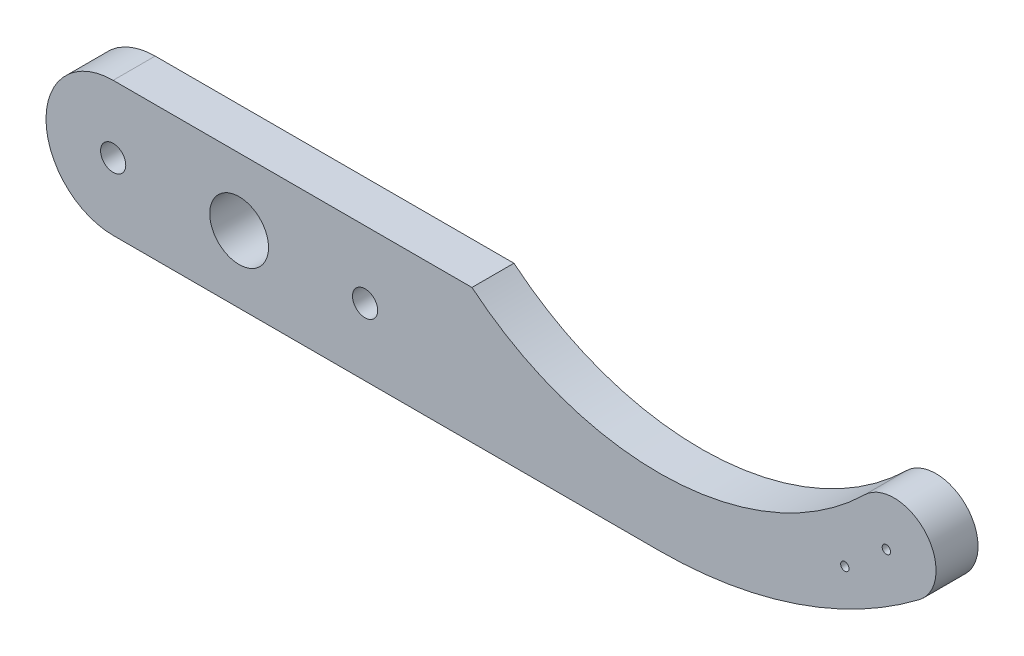
ISO-10303-21;
HEADER;
FILE_DESCRIPTION(('STEP AP214'),'2;1');
FILE_NAME('part.step','',(''),(''),'','','');
FILE_SCHEMA(('AUTOMOTIVE_DESIGN { 1 0 10303 214 1 1 1 1 }'));
ENDSEC;
DATA;
#1=APPLICATION_CONTEXT('core data for automotive mechanical design processes');
#2=APPLICATION_PROTOCOL_DEFINITION('international standard','automotive_design',2000,#1);
#3=PRODUCT_CONTEXT('',#1,'mechanical');
#4=PRODUCT('Part','Part','',(#3));
#5=PRODUCT_RELATED_PRODUCT_CATEGORY('part','',(#4));
#6=PRODUCT_DEFINITION_FORMATION('','',#4);
#7=PRODUCT_DEFINITION_CONTEXT('part definition',#1,'design');
#8=PRODUCT_DEFINITION('design','',#6,#7);
#9=PRODUCT_DEFINITION_SHAPE('','',#8);
#10=(LENGTH_UNIT() NAMED_UNIT(*) SI_UNIT(.MILLI.,.METRE.));
#11=(NAMED_UNIT(*) PLANE_ANGLE_UNIT() SI_UNIT($,.RADIAN.));
#12=(NAMED_UNIT(*) SI_UNIT($,.STERADIAN.) SOLID_ANGLE_UNIT());
#13=UNCERTAINTY_MEASURE_WITH_UNIT(LENGTH_MEASURE(1.E-05),#10,'distance_accuracy_value','');
#14=(GEOMETRIC_REPRESENTATION_CONTEXT(3) GLOBAL_UNCERTAINTY_ASSIGNED_CONTEXT((#13)) GLOBAL_UNIT_ASSIGNED_CONTEXT((#10,
#11,#12)) REPRESENTATION_CONTEXT('',''));
#15=CARTESIAN_POINT('',(0.,0.,0.));
#16=DIRECTION('',(0.,0.,1.));
#17=DIRECTION('',(1.,0.,0.));
#18=AXIS2_PLACEMENT_3D('',#15,#16,#17);
#19=CARTESIAN_POINT('',(-15.,0.,5.));
#20=DIRECTION('',(0.,0.,1.));
#21=DIRECTION('',(1.,0.,0.));
#22=AXIS2_PLACEMENT_3D('',#19,#20,#21);
#23=PLANE('',#22);
#24=CARTESIAN_POINT('',(-15.,0.,5.));
#25=DIRECTION('',(0.,0.,1.));
#26=DIRECTION('',(1.,0.,0.));
#27=AXIS2_PLACEMENT_3D('',#24,#25,#26);
#28=CIRCLE('',#27,1.5);
#29=CARTESIAN_POINT('',(-13.5,0.,5.));
#30=VERTEX_POINT('',#29);
#31=EDGE_CURVE('E197',#30,#30,#28,.T.);
#32=ORIENTED_EDGE('',*,*,#31,.F.);
#33=EDGE_LOOP('',(#32));
#34=FACE_BOUND('',#33,.T.);
#35=CARTESIAN_POINT('',(15.,0.,5.));
#36=DIRECTION('',(0.,0.,1.));
#37=DIRECTION('',(1.,0.,0.));
#38=AXIS2_PLACEMENT_3D('',#35,#36,#37);
#39=CIRCLE('',#38,1.5);
#40=CARTESIAN_POINT('',(16.5,0.,5.));
#41=VERTEX_POINT('',#40);
#42=EDGE_CURVE('E209',#41,#41,#39,.T.);
#43=ORIENTED_EDGE('',*,*,#42,.F.);
#44=EDGE_LOOP('',(#43));
#45=FACE_BOUND('',#44,.T.);
#46=DIRECTION('',(-1.,0.,0.));
#47=VECTOR('',#46,1.);
#48=CARTESIAN_POINT('',(0.,8.,5.));
#49=LINE('',#48,#47);
#50=CARTESIAN_POINT('',(27.7289425486799,8.,5.));
#51=VERTEX_POINT('',#50);
#52=CARTESIAN_POINT('',(-15.,8.,5.));
#53=VERTEX_POINT('',#52);
#54=EDGE_CURVE('E52',#51,#53,#49,.T.);
#55=ORIENTED_EDGE('',*,*,#54,.T.);
#56=CARTESIAN_POINT('',(-15.,0.,5.));
#57=DIRECTION('',(0.,0.,1.));
#58=DIRECTION('',(1.,0.,0.));
#59=AXIS2_PLACEMENT_3D('',#56,#57,#58);
#60=CIRCLE('',#59,8.);
#61=CARTESIAN_POINT('',(-15.,-8.,5.));
#62=VERTEX_POINT('',#61);
#63=EDGE_CURVE('E91',#53,#62,#60,.T.);
#64=ORIENTED_EDGE('',*,*,#63,.T.);
#65=DIRECTION('',(1.,0.,0.));
#66=VECTOR('',#65,1.);
#67=CARTESIAN_POINT('',(0.,-8.,5.));
#68=LINE('',#67,#66);
#69=CARTESIAN_POINT('',(50.,-7.99999999999999,5.));
#70=VERTEX_POINT('',#69);
#71=EDGE_CURVE('E105',#62,#70,#68,.T.);
#72=ORIENTED_EDGE('',*,*,#71,.T.);
#73=CARTESIAN_POINT('',(50.,43.2677160345627,5.));
#74=DIRECTION('',(0.,0.,1.));
#75=DIRECTION('',(1.,0.,0.));
#76=AXIS2_PLACEMENT_3D('',#73,#74,#75);
#77=CIRCLE('',#76,51.2677160345627);
#78=CARTESIAN_POINT('',(81.0258679701288,2.45381859630412,5.));
#79=VERTEX_POINT('',#78);
#80=EDGE_CURVE('E99',#70,#79,#77,.T.);
#81=ORIENTED_EDGE('',*,*,#80,.T.);
#82=CARTESIAN_POINT('',(78.,6.43428628582859,5.));
#83=DIRECTION('',(0.,0.,1.));
#84=DIRECTION('',(-1.,0.,0.));
#85=AXIS2_PLACEMENT_3D('',#82,#83,#84);
#86=CIRCLE('',#85,5.);
#87=CARTESIAN_POINT('',(74.5,10.0050005001,5.));
#88=VERTEX_POINT('',#87);
#89=EDGE_CURVE('E103',#79,#88,#86,.T.);
#90=ORIENTED_EDGE('',*,*,#89,.T.);
#91=CARTESIAN_POINT('',(50.,35.,5.));
#92=DIRECTION('',(0.,0.,-1.));
#93=DIRECTION('',(1.,0.,0.));
#94=AXIS2_PLACEMENT_3D('',#91,#92,#93);
#95=CIRCLE('',#94,35.);
#96=EDGE_CURVE('E119',#88,#51,#95,.T.);
#97=ORIENTED_EDGE('',*,*,#96,.T.);
#98=EDGE_LOOP('',(#55,#64,#72,#81,#90,#97));
#99=FACE_BOUND('',#98,.T.);
#100=CARTESIAN_POINT('',(0.,0.,5.));
#101=DIRECTION('',(0.,0.,1.));
#102=DIRECTION('',(1.,0.,0.));
#103=AXIS2_PLACEMENT_3D('',#100,#101,#102);
#104=CIRCLE('',#103,3.5);
#105=CARTESIAN_POINT('',(3.5,0.,5.));
#106=VERTEX_POINT('',#105);
#107=EDGE_CURVE('E129',#106,#106,#104,.T.);
#108=ORIENTED_EDGE('',*,*,#107,.F.);
#109=EDGE_LOOP('',(#108));
#110=FACE_BOUND('',#109,.T.);
#111=CARTESIAN_POINT('',(77.0842900665423,5.65421156455629,5.));
#112=DIRECTION('',(0.,0.,1.));
#113=DIRECTION('',(1.,0.,0.));
#114=AXIS2_PLACEMENT_3D('',#111,#112,#113);
#115=CIRCLE('',#114,0.499999999999999);
#116=CARTESIAN_POINT('',(77.5842900665423,5.65421156455629,5.));
#117=VERTEX_POINT('',#116);
#118=EDGE_CURVE('E203',#117,#117,#115,.T.);
#119=ORIENTED_EDGE('',*,*,#118,.F.);
#120=EDGE_LOOP('',(#119));
#121=FACE_BOUND('',#120,.T.);
#122=CARTESIAN_POINT('',(72.1362771369249,1.43909969791038,5.));
#123=DIRECTION('',(0.,0.,1.));
#124=DIRECTION('',(1.,0.,0.));
#125=AXIS2_PLACEMENT_3D('',#122,#123,#124);
#126=CIRCLE('',#125,0.499999999999998);
#127=CARTESIAN_POINT('',(72.6362771369249,1.43909969791038,5.));
#128=VERTEX_POINT('',#127);
#129=EDGE_CURVE('E188',#128,#128,#126,.T.);
#130=ORIENTED_EDGE('',*,*,#129,.F.);
#131=EDGE_LOOP('',(#130));
#132=FACE_BOUND('',#131,.T.);
#133=ADVANCED_FACE('F35',(#34,#45,#99,#110,#121,#132),#23,.T.);
#134=CARTESIAN_POINT('',(-15.,0.,0.));
#135=DIRECTION('',(0.,0.,1.));
#136=DIRECTION('',(1.,0.,0.));
#137=AXIS2_PLACEMENT_3D('',#134,#135,#136);
#138=PLANE('',#137);
#139=CARTESIAN_POINT('',(-15.,0.,0.));
#140=DIRECTION('',(0.,0.,1.));
#141=DIRECTION('',(1.,0.,0.));
#142=AXIS2_PLACEMENT_3D('',#139,#140,#141);
#143=CIRCLE('',#142,1.5);
#144=CARTESIAN_POINT('',(-13.5,0.,0.));
#145=VERTEX_POINT('',#144);
#146=EDGE_CURVE('E194',#145,#145,#143,.T.);
#147=ORIENTED_EDGE('',*,*,#146,.T.);
#148=EDGE_LOOP('',(#147));
#149=FACE_BOUND('',#148,.T.);
#150=CARTESIAN_POINT('',(15.,0.,0.));
#151=DIRECTION('',(0.,0.,1.));
#152=DIRECTION('',(1.,0.,0.));
#153=AXIS2_PLACEMENT_3D('',#150,#151,#152);
#154=CIRCLE('',#153,1.5);
#155=CARTESIAN_POINT('',(16.5,0.,0.));
#156=VERTEX_POINT('',#155);
#157=EDGE_CURVE('E206',#156,#156,#154,.T.);
#158=ORIENTED_EDGE('',*,*,#157,.T.);
#159=EDGE_LOOP('',(#158));
#160=FACE_BOUND('',#159,.T.);
#161=CARTESIAN_POINT('',(-15.,0.,0.));
#162=DIRECTION('',(0.,0.,1.));
#163=DIRECTION('',(1.,0.,0.));
#164=AXIS2_PLACEMENT_3D('',#161,#162,#163);
#165=CIRCLE('',#164,8.);
#166=CARTESIAN_POINT('',(-15.,8.,0.));
#167=VERTEX_POINT('',#166);
#168=CARTESIAN_POINT('',(-15.,-8.,0.));
#169=VERTEX_POINT('',#168);
#170=EDGE_CURVE('E125',#167,#169,#165,.T.);
#171=ORIENTED_EDGE('',*,*,#170,.F.);
#172=DIRECTION('',(-1.,0.,0.));
#173=VECTOR('',#172,1.);
#174=CARTESIAN_POINT('',(0.,8.,0.));
#175=LINE('',#174,#173);
#176=CARTESIAN_POINT('',(27.7289425486799,8.,0.));
#177=VERTEX_POINT('',#176);
#178=EDGE_CURVE('E83',#177,#167,#175,.T.);
#179=ORIENTED_EDGE('',*,*,#178,.F.);
#180=CARTESIAN_POINT('',(50.,35.,0.));
#181=DIRECTION('',(0.,0.,-1.));
#182=DIRECTION('',(1.,0.,0.));
#183=AXIS2_PLACEMENT_3D('',#180,#181,#182);
#184=CIRCLE('',#183,35.);
#185=CARTESIAN_POINT('',(74.5,10.0050005001,0.));
#186=VERTEX_POINT('',#185);
#187=EDGE_CURVE('E133',#186,#177,#184,.T.);
#188=ORIENTED_EDGE('',*,*,#187,.F.);
#189=CARTESIAN_POINT('',(78.,6.43428628582859,0.));
#190=DIRECTION('',(0.,0.,1.));
#191=DIRECTION('',(-1.,0.,0.));
#192=AXIS2_PLACEMENT_3D('',#189,#190,#191);
#193=CIRCLE('',#192,5.);
#194=CARTESIAN_POINT('',(81.0258679701288,2.45381859630412,0.));
#195=VERTEX_POINT('',#194);
#196=EDGE_CURVE('E76',#195,#186,#193,.T.);
#197=ORIENTED_EDGE('',*,*,#196,.F.);
#198=CARTESIAN_POINT('',(50.,43.2677160345627,0.));
#199=DIRECTION('',(0.,0.,1.));
#200=DIRECTION('',(1.,0.,0.));
#201=AXIS2_PLACEMENT_3D('',#198,#199,#200);
#202=CIRCLE('',#201,51.2677160345627);
#203=CARTESIAN_POINT('',(50.,-7.99999999999999,0.));
#204=VERTEX_POINT('',#203);
#205=EDGE_CURVE('E113',#204,#195,#202,.T.);
#206=ORIENTED_EDGE('',*,*,#205,.F.);
#207=DIRECTION('',(1.,0.,0.));
#208=VECTOR('',#207,1.);
#209=CARTESIAN_POINT('',(0.,-8.,0.));
#210=LINE('',#209,#208);
#211=EDGE_CURVE('E128',#169,#204,#210,.T.);
#212=ORIENTED_EDGE('',*,*,#211,.F.);
#213=EDGE_LOOP('',(#171,#179,#188,#197,#206,#212));
#214=FACE_BOUND('',#213,.T.);
#215=CARTESIAN_POINT('',(0.,0.,0.));
#216=DIRECTION('',(0.,0.,1.));
#217=DIRECTION('',(1.,0.,0.));
#218=AXIS2_PLACEMENT_3D('',#215,#216,#217);
#219=CIRCLE('',#218,3.5);
#220=CARTESIAN_POINT('',(3.5,0.,0.));
#221=VERTEX_POINT('',#220);
#222=EDGE_CURVE('E212',#221,#221,#219,.T.);
#223=ORIENTED_EDGE('',*,*,#222,.T.);
#224=EDGE_LOOP('',(#223));
#225=FACE_BOUND('',#224,.T.);
#226=CARTESIAN_POINT('',(77.0842900665423,5.65421156455629,0.));
#227=DIRECTION('',(0.,0.,1.));
#228=DIRECTION('',(1.,0.,0.));
#229=AXIS2_PLACEMENT_3D('',#226,#227,#228);
#230=CIRCLE('',#229,0.499999999999999);
#231=CARTESIAN_POINT('',(77.5842900665423,5.65421156455629,0.));
#232=VERTEX_POINT('',#231);
#233=EDGE_CURVE('E200',#232,#232,#230,.T.);
#234=ORIENTED_EDGE('',*,*,#233,.T.);
#235=EDGE_LOOP('',(#234));
#236=FACE_BOUND('',#235,.T.);
#237=CARTESIAN_POINT('',(72.1362771369249,1.43909969791038,0.));
#238=DIRECTION('',(0.,0.,1.));
#239=DIRECTION('',(1.,0.,0.));
#240=AXIS2_PLACEMENT_3D('',#237,#238,#239);
#241=CIRCLE('',#240,0.499999999999998);
#242=CARTESIAN_POINT('',(72.6362771369249,1.43909969791038,0.));
#243=VERTEX_POINT('',#242);
#244=EDGE_CURVE('E191',#243,#243,#241,.T.);
#245=ORIENTED_EDGE('',*,*,#244,.T.);
#246=EDGE_LOOP('',(#245));
#247=FACE_BOUND('',#246,.T.);
#248=ADVANCED_FACE('F141',(#149,#160,#214,#225,#236,#247),#138,.F.);
#249=CARTESIAN_POINT('',(-15.,0.,5.));
#250=DIRECTION('',(0.,0.,-1.));
#251=DIRECTION('',(-1.,0.,0.));
#252=AXIS2_PLACEMENT_3D('',#249,#250,#251);
#253=CYLINDRICAL_SURFACE('',#252,8.);
#254=ORIENTED_EDGE('',*,*,#170,.T.);
#255=DIRECTION('',(0.,0.,-1.));
#256=VECTOR('',#255,1.);
#257=CARTESIAN_POINT('',(-15.,-8.,5.));
#258=LINE('',#257,#256);
#259=EDGE_CURVE('E44',#62,#169,#258,.T.);
#260=ORIENTED_EDGE('',*,*,#259,.F.);
#261=ORIENTED_EDGE('',*,*,#63,.F.);
#262=DIRECTION('',(0.,0.,-1.));
#263=VECTOR('',#262,1.);
#264=CARTESIAN_POINT('',(-15.,8.,5.));
#265=LINE('',#264,#263);
#266=EDGE_CURVE('E11',#53,#167,#265,.T.);
#267=ORIENTED_EDGE('',*,*,#266,.T.);
#268=EDGE_LOOP('',(#254,#260,#261,#267));
#269=FACE_BOUND('',#268,.T.);
#270=ADVANCED_FACE('F37',(#269),#253,.T.);
#271=CARTESIAN_POINT('',(0.,-8.,5.));
#272=DIRECTION('',(0.,1.,0.));
#273=DIRECTION('',(0.,0.,1.));
#274=AXIS2_PLACEMENT_3D('',#271,#272,#273);
#275=PLANE('',#274);
#276=ORIENTED_EDGE('',*,*,#211,.T.);
#277=DIRECTION('',(0.,0.,-1.));
#278=VECTOR('',#277,1.);
#279=CARTESIAN_POINT('',(50.,-7.99999999999999,5.));
#280=LINE('',#279,#278);
#281=EDGE_CURVE('E114',#70,#204,#280,.T.);
#282=ORIENTED_EDGE('',*,*,#281,.F.);
#283=ORIENTED_EDGE('',*,*,#71,.F.);
#284=ORIENTED_EDGE('',*,*,#259,.T.);
#285=EDGE_LOOP('',(#276,#282,#283,#284));
#286=FACE_BOUND('',#285,.T.);
#287=ADVANCED_FACE('F140',(#286),#275,.F.);
#288=CARTESIAN_POINT('',(50.,43.2677160345627,5.));
#289=DIRECTION('',(0.,0.,-1.));
#290=DIRECTION('',(-1.,0.,0.));
#291=AXIS2_PLACEMENT_3D('',#288,#289,#290);
#292=CYLINDRICAL_SURFACE('',#291,51.2677160345627);
#293=ORIENTED_EDGE('',*,*,#205,.T.);
#294=DIRECTION('',(0.,0.,-1.));
#295=VECTOR('',#294,1.);
#296=CARTESIAN_POINT('',(81.0258679701288,2.45381859630412,5.));
#297=LINE('',#296,#295);
#298=EDGE_CURVE('E110',#79,#195,#297,.T.);
#299=ORIENTED_EDGE('',*,*,#298,.F.);
#300=ORIENTED_EDGE('',*,*,#80,.F.);
#301=ORIENTED_EDGE('',*,*,#281,.T.);
#302=EDGE_LOOP('',(#293,#299,#300,#301));
#303=FACE_BOUND('',#302,.T.);
#304=ADVANCED_FACE('F111',(#303),#292,.T.);
#305=CARTESIAN_POINT('',(78.,6.43428628582859,5.));
#306=DIRECTION('',(0.,0.,-1.));
#307=DIRECTION('',(-1.,0.,0.));
#308=AXIS2_PLACEMENT_3D('',#305,#306,#307);
#309=CYLINDRICAL_SURFACE('',#308,5.);
#310=ORIENTED_EDGE('',*,*,#196,.T.);
#311=DIRECTION('',(0.,0.,-1.));
#312=VECTOR('',#311,1.);
#313=CARTESIAN_POINT('',(74.5,10.0050005001,5.));
#314=LINE('',#313,#312);
#315=EDGE_CURVE('E115',#88,#186,#314,.T.);
#316=ORIENTED_EDGE('',*,*,#315,.F.);
#317=ORIENTED_EDGE('',*,*,#89,.F.);
#318=ORIENTED_EDGE('',*,*,#298,.T.);
#319=EDGE_LOOP('',(#310,#316,#317,#318));
#320=FACE_BOUND('',#319,.T.);
#321=ADVANCED_FACE('F117',(#320),#309,.T.);
#322=CARTESIAN_POINT('',(50.,35.,5.));
#323=DIRECTION('',(0.,0.,-1.));
#324=DIRECTION('',(-1.,0.,0.));
#325=AXIS2_PLACEMENT_3D('',#322,#323,#324);
#326=CYLINDRICAL_SURFACE('',#325,35.);
#327=ORIENTED_EDGE('',*,*,#187,.T.);
#328=DIRECTION('',(0.,0.,-1.));
#329=VECTOR('',#328,1.);
#330=CARTESIAN_POINT('',(27.7289425486799,8.,5.));
#331=LINE('',#330,#329);
#332=EDGE_CURVE('E121',#51,#177,#331,.T.);
#333=ORIENTED_EDGE('',*,*,#332,.F.);
#334=ORIENTED_EDGE('',*,*,#96,.F.);
#335=ORIENTED_EDGE('',*,*,#315,.T.);
#336=EDGE_LOOP('',(#327,#333,#334,#335));
#337=FACE_BOUND('',#336,.T.);
#338=ADVANCED_FACE('F145',(#337),#326,.F.);
#339=CARTESIAN_POINT('',(0.,8.,5.));
#340=DIRECTION('',(0.,-1.,0.));
#341=DIRECTION('',(0.,0.,-1.));
#342=AXIS2_PLACEMENT_3D('',#339,#340,#341);
#343=PLANE('',#342);
#344=ORIENTED_EDGE('',*,*,#178,.T.);
#345=ORIENTED_EDGE('',*,*,#266,.F.);
#346=ORIENTED_EDGE('',*,*,#54,.F.);
#347=ORIENTED_EDGE('',*,*,#332,.T.);
#348=EDGE_LOOP('',(#344,#345,#346,#347));
#349=FACE_BOUND('',#348,.T.);
#350=ADVANCED_FACE('F146',(#349),#343,.F.);
#351=CARTESIAN_POINT('',(0.,0.,5.));
#352=DIRECTION('',(0.,0.,-1.));
#353=DIRECTION('',(-1.,0.,0.));
#354=AXIS2_PLACEMENT_3D('',#351,#352,#353);
#355=CYLINDRICAL_SURFACE('',#354,3.5);
#356=ORIENTED_EDGE('',*,*,#107,.T.);
#357=EDGE_LOOP('',(#356));
#358=FACE_BOUND('',#357,.T.);
#359=ORIENTED_EDGE('',*,*,#222,.F.);
#360=EDGE_LOOP('',(#359));
#361=FACE_BOUND('',#360,.T.);
#362=ADVANCED_FACE('F148',(#358,#361),#355,.F.);
#363=CARTESIAN_POINT('',(15.,0.,5.));
#364=DIRECTION('',(0.,0.,-1.));
#365=DIRECTION('',(-1.,0.,0.));
#366=AXIS2_PLACEMENT_3D('',#363,#364,#365);
#367=CYLINDRICAL_SURFACE('',#366,1.5);
#368=ORIENTED_EDGE('',*,*,#42,.T.);
#369=EDGE_LOOP('',(#368));
#370=FACE_BOUND('',#369,.T.);
#371=ORIENTED_EDGE('',*,*,#157,.F.);
#372=EDGE_LOOP('',(#371));
#373=FACE_BOUND('',#372,.T.);
#374=ADVANCED_FACE('F154',(#370,#373),#367,.F.);
#375=CARTESIAN_POINT('',(77.0842900665423,5.65421156455629,5.));
#376=DIRECTION('',(0.,0.,-1.));
#377=DIRECTION('',(-1.,0.,0.));
#378=AXIS2_PLACEMENT_3D('',#375,#376,#377);
#379=CYLINDRICAL_SURFACE('',#378,0.499999999999999);
#380=ORIENTED_EDGE('',*,*,#118,.T.);
#381=EDGE_LOOP('',(#380));
#382=FACE_BOUND('',#381,.T.);
#383=ORIENTED_EDGE('',*,*,#233,.F.);
#384=EDGE_LOOP('',(#383));
#385=FACE_BOUND('',#384,.T.);
#386=ADVANCED_FACE('F171',(#382,#385),#379,.F.);
#387=CARTESIAN_POINT('',(-15.,0.,5.));
#388=DIRECTION('',(0.,0.,-1.));
#389=DIRECTION('',(-1.,0.,0.));
#390=AXIS2_PLACEMENT_3D('',#387,#388,#389);
#391=CYLINDRICAL_SURFACE('',#390,1.5);
#392=ORIENTED_EDGE('',*,*,#31,.T.);
#393=EDGE_LOOP('',(#392));
#394=FACE_BOUND('',#393,.T.);
#395=ORIENTED_EDGE('',*,*,#146,.F.);
#396=EDGE_LOOP('',(#395));
#397=FACE_BOUND('',#396,.T.);
#398=ADVANCED_FACE('F175',(#394,#397),#391,.F.);
#399=CARTESIAN_POINT('',(72.1362771369249,1.43909969791038,5.));
#400=DIRECTION('',(0.,0.,-1.));
#401=DIRECTION('',(-1.,0.,0.));
#402=AXIS2_PLACEMENT_3D('',#399,#400,#401);
#403=CYLINDRICAL_SURFACE('',#402,0.499999999999998);
#404=ORIENTED_EDGE('',*,*,#129,.T.);
#405=EDGE_LOOP('',(#404));
#406=FACE_BOUND('',#405,.T.);
#407=ORIENTED_EDGE('',*,*,#244,.F.);
#408=EDGE_LOOP('',(#407));
#409=FACE_BOUND('',#408,.T.);
#410=ADVANCED_FACE('F179',(#406,#409),#403,.F.);
#411=CLOSED_SHELL('',(#133,#248,#270,#287,#304,#321,#338,#350,#362,#374,#386,#398,#410));
#412=MANIFOLD_SOLID_BREP('B2',#411);
#413=ADVANCED_BREP_SHAPE_REPRESENTATION('',(#18,#412),#14);
#414=SHAPE_DEFINITION_REPRESENTATION(#9,#413);
ENDSEC;
END-ISO-10303-21;
